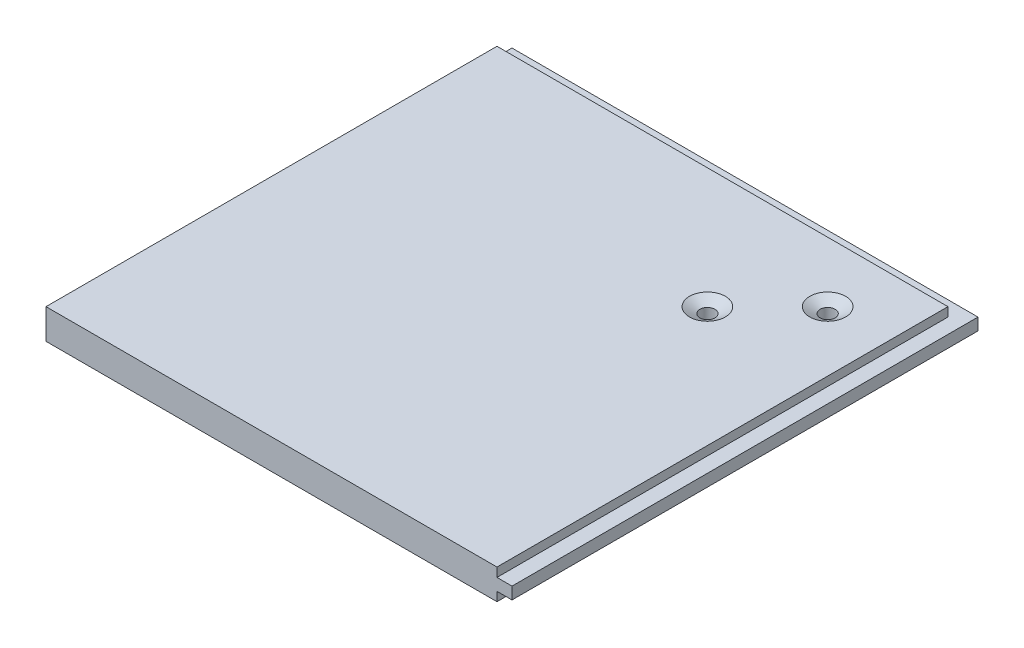
ISO-10303-21;
HEADER;
FILE_DESCRIPTION(('STEP AP214'),'2;1');
FILE_NAME('part.step','',(''),(''),'','','');
FILE_SCHEMA(('AUTOMOTIVE_DESIGN { 1 0 10303 214 1 1 1 1 }'));
ENDSEC;
DATA;
#1=APPLICATION_CONTEXT('core data for automotive mechanical design processes');
#2=APPLICATION_PROTOCOL_DEFINITION('international standard','automotive_design',2000,#1);
#3=PRODUCT_CONTEXT('',#1,'mechanical');
#4=PRODUCT('Part','Part','',(#3));
#5=PRODUCT_RELATED_PRODUCT_CATEGORY('part','',(#4));
#6=PRODUCT_DEFINITION_FORMATION('','',#4);
#7=PRODUCT_DEFINITION_CONTEXT('part definition',#1,'design');
#8=PRODUCT_DEFINITION('design','',#6,#7);
#9=PRODUCT_DEFINITION_SHAPE('','',#8);
#10=(LENGTH_UNIT() NAMED_UNIT(*) SI_UNIT(.MILLI.,.METRE.));
#11=(NAMED_UNIT(*) PLANE_ANGLE_UNIT() SI_UNIT($,.RADIAN.));
#12=(NAMED_UNIT(*) SI_UNIT($,.STERADIAN.) SOLID_ANGLE_UNIT());
#13=UNCERTAINTY_MEASURE_WITH_UNIT(LENGTH_MEASURE(1.E-05),#10,'distance_accuracy_value','');
#14=(GEOMETRIC_REPRESENTATION_CONTEXT(3) GLOBAL_UNCERTAINTY_ASSIGNED_CONTEXT((#13)) GLOBAL_UNIT_ASSIGNED_CONTEXT((#10,
#11,#12)) REPRESENTATION_CONTEXT('',''));
#15=CARTESIAN_POINT('',(0.,0.,0.));
#16=DIRECTION('',(0.,0.,1.));
#17=DIRECTION('',(1.,0.,0.));
#18=AXIS2_PLACEMENT_3D('',#15,#16,#17);
#19=CARTESIAN_POINT('',(0.,10.,-150.));
#20=DIRECTION('',(0.,0.,1.));
#21=DIRECTION('',(1.,0.,0.));
#22=AXIS2_PLACEMENT_3D('',#19,#20,#21);
#23=PLANE('',#22);
#24=DIRECTION('',(-1.,0.,0.));
#25=VECTOR('',#24,1.);
#26=CARTESIAN_POINT('',(155.,2.99999999999999,-150.));
#27=LINE('',#26,#25);
#28=CARTESIAN_POINT('',(150.,2.99999999999999,-150.));
#29=VERTEX_POINT('',#28);
#30=CARTESIAN_POINT('',(0.,3.,-150.));
#31=VERTEX_POINT('',#30);
#32=EDGE_CURVE('E201',#29,#31,#27,.T.);
#33=ORIENTED_EDGE('',*,*,#32,.F.);
#34=DIRECTION('',(0.,-1.,0.));
#35=VECTOR('',#34,1.);
#36=CARTESIAN_POINT('',(150.,10.,-150.));
#37=LINE('',#36,#35);
#38=CARTESIAN_POINT('',(150.,0.,-150.));
#39=VERTEX_POINT('',#38);
#40=EDGE_CURVE('E195',#29,#39,#37,.T.);
#41=ORIENTED_EDGE('',*,*,#40,.T.);
#42=DIRECTION('',(-1.,0.,0.));
#43=VECTOR('',#42,1.);
#44=CARTESIAN_POINT('',(0.,0.,-150.));
#45=LINE('',#44,#43);
#46=CARTESIAN_POINT('',(0.,0.,-150.));
#47=VERTEX_POINT('',#46);
#48=EDGE_CURVE('E187',#39,#47,#45,.T.);
#49=ORIENTED_EDGE('',*,*,#48,.T.);
#50=DIRECTION('',(0.,-1.,0.));
#51=VECTOR('',#50,1.);
#52=CARTESIAN_POINT('',(0.,10.,-150.));
#53=LINE('',#52,#51);
#54=EDGE_CURVE('E193',#31,#47,#53,.T.);
#55=ORIENTED_EDGE('',*,*,#54,.F.);
#56=EDGE_LOOP('',(#33,#41,#49,#55));
#57=FACE_BOUND('',#56,.T.);
#58=ADVANCED_FACE('F43',(#57),#23,.F.);
#59=DIRECTION('',(1.,0.,0.));
#60=VECTOR('',#59,1.);
#61=CARTESIAN_POINT('',(0.,7.,-150.));
#62=LINE('',#61,#60);
#63=CARTESIAN_POINT('',(0.,7.,-150.));
#64=VERTEX_POINT('',#63);
#65=CARTESIAN_POINT('',(150.,6.99999999999998,-150.));
#66=VERTEX_POINT('',#65);
#67=EDGE_CURVE('E143',#64,#66,#62,.T.);
#68=ORIENTED_EDGE('',*,*,#67,.F.);
#69=CARTESIAN_POINT('',(0.,10.,-150.));
#70=VERTEX_POINT('',#69);
#71=EDGE_CURVE('E149',#70,#64,#53,.T.);
#72=ORIENTED_EDGE('',*,*,#71,.F.);
#73=DIRECTION('',(-1.,0.,0.));
#74=VECTOR('',#73,1.);
#75=CARTESIAN_POINT('',(0.,10.,-150.));
#76=LINE('',#75,#74);
#77=CARTESIAN_POINT('',(150.,10.,-150.));
#78=VERTEX_POINT('',#77);
#79=EDGE_CURVE('E177',#78,#70,#76,.T.);
#80=ORIENTED_EDGE('',*,*,#79,.F.);
#81=EDGE_CURVE('E196',#78,#66,#37,.T.);
#82=ORIENTED_EDGE('',*,*,#81,.T.);
#83=EDGE_LOOP('',(#68,#72,#80,#82));
#84=FACE_BOUND('',#83,.T.);
#85=ADVANCED_FACE('F235',(#84),#23,.F.);
#86=CARTESIAN_POINT('',(150.,10.,-150.));
#87=DIRECTION('',(-1.,0.,0.));
#88=DIRECTION('',(0.,0.,1.));
#89=AXIS2_PLACEMENT_3D('',#86,#87,#88);
#90=PLANE('',#89);
#91=DIRECTION('',(0.,0.,1.));
#92=VECTOR('',#91,1.);
#93=CARTESIAN_POINT('',(150.,6.99999999999998,0.));
#94=LINE('',#93,#92);
#95=CARTESIAN_POINT('',(150.,6.99999999999998,0.));
#96=VERTEX_POINT('',#95);
#97=EDGE_CURVE('E152',#66,#96,#94,.T.);
#98=ORIENTED_EDGE('',*,*,#97,.F.);
#99=ORIENTED_EDGE('',*,*,#81,.F.);
#100=DIRECTION('',(0.,0.,-1.));
#101=VECTOR('',#100,1.);
#102=CARTESIAN_POINT('',(150.,10.,-150.));
#103=LINE('',#102,#101);
#104=CARTESIAN_POINT('',(150.,10.,0.));
#105=VERTEX_POINT('',#104);
#106=EDGE_CURVE('E174',#105,#78,#103,.T.);
#107=ORIENTED_EDGE('',*,*,#106,.F.);
#108=DIRECTION('',(0.,-1.,0.));
#109=VECTOR('',#108,1.);
#110=CARTESIAN_POINT('',(150.,10.,0.));
#111=LINE('',#110,#109);
#112=EDGE_CURVE('E67',#105,#96,#111,.T.);
#113=ORIENTED_EDGE('',*,*,#112,.T.);
#114=EDGE_LOOP('',(#98,#99,#107,#113));
#115=FACE_BOUND('',#114,.T.);
#116=ADVANCED_FACE('F232',(#115),#90,.F.);
#117=DIRECTION('',(0.,0.,-1.));
#118=VECTOR('',#117,1.);
#119=CARTESIAN_POINT('',(150.,2.99999999999999,-150.));
#120=LINE('',#119,#118);
#121=CARTESIAN_POINT('',(150.,2.99999999999999,0.));
#122=VERTEX_POINT('',#121);
#123=EDGE_CURVE('E59',#122,#29,#120,.T.);
#124=ORIENTED_EDGE('',*,*,#123,.F.);
#125=CARTESIAN_POINT('',(150.,0.,0.));
#126=VERTEX_POINT('',#125);
#127=EDGE_CURVE('E199',#122,#126,#111,.T.);
#128=ORIENTED_EDGE('',*,*,#127,.T.);
#129=DIRECTION('',(0.,0.,-1.));
#130=VECTOR('',#129,1.);
#131=CARTESIAN_POINT('',(150.,0.,-150.));
#132=LINE('',#131,#130);
#133=EDGE_CURVE('E184',#126,#39,#132,.T.);
#134=ORIENTED_EDGE('',*,*,#133,.T.);
#135=ORIENTED_EDGE('',*,*,#40,.F.);
#136=EDGE_LOOP('',(#124,#128,#134,#135));
#137=FACE_BOUND('',#136,.T.);
#138=ADVANCED_FACE('F241',(#137),#90,.F.);
#139=CARTESIAN_POINT('',(0.,10.,0.));
#140=DIRECTION('',(0.,0.,-1.));
#141=DIRECTION('',(-1.,0.,0.));
#142=AXIS2_PLACEMENT_3D('',#139,#140,#141);
#143=PLANE('',#142);
#144=DIRECTION('',(1.,0.,0.));
#145=VECTOR('',#144,1.);
#146=CARTESIAN_POINT('',(0.,0.,0.));
#147=LINE('',#146,#145);
#148=CARTESIAN_POINT('',(0.,0.,0.));
#149=VERTEX_POINT('',#148);
#150=EDGE_CURVE('E170',#149,#126,#147,.T.);
#151=ORIENTED_EDGE('',*,*,#150,.T.);
#152=ORIENTED_EDGE('',*,*,#127,.F.);
#153=DIRECTION('',(-1.,0.,0.));
#154=VECTOR('',#153,1.);
#155=CARTESIAN_POINT('',(155.,2.99999999999998,0.));
#156=LINE('',#155,#154);
#157=CARTESIAN_POINT('',(155.,2.99999999999998,0.));
#158=VERTEX_POINT('',#157);
#159=EDGE_CURVE('E167',#158,#122,#156,.T.);
#160=ORIENTED_EDGE('',*,*,#159,.F.);
#161=DIRECTION('',(0.,-1.,0.));
#162=VECTOR('',#161,1.);
#163=CARTESIAN_POINT('',(155.,2.99999999999998,0.));
#164=LINE('',#163,#162);
#165=CARTESIAN_POINT('',(155.,6.99999999999998,0.));
#166=VERTEX_POINT('',#165);
#167=EDGE_CURVE('E157',#166,#158,#164,.T.);
#168=ORIENTED_EDGE('',*,*,#167,.F.);
#169=DIRECTION('',(-1.,0.,0.));
#170=VECTOR('',#169,1.);
#171=CARTESIAN_POINT('',(155.,6.99999999999998,0.));
#172=LINE('',#171,#170);
#173=EDGE_CURVE('E162',#166,#96,#172,.T.);
#174=ORIENTED_EDGE('',*,*,#173,.T.);
#175=ORIENTED_EDGE('',*,*,#112,.F.);
#176=DIRECTION('',(1.,0.,0.));
#177=VECTOR('',#176,1.);
#178=CARTESIAN_POINT('',(0.,10.,0.));
#179=LINE('',#178,#177);
#180=CARTESIAN_POINT('',(0.,10.,0.));
#181=VERTEX_POINT('',#180);
#182=EDGE_CURVE('E171',#181,#105,#179,.T.);
#183=ORIENTED_EDGE('',*,*,#182,.F.);
#184=DIRECTION('',(0.,-1.,0.));
#185=VECTOR('',#184,1.);
#186=CARTESIAN_POINT('',(0.,10.,0.));
#187=LINE('',#186,#185);
#188=EDGE_CURVE('E181',#181,#149,#187,.T.);
#189=ORIENTED_EDGE('',*,*,#188,.T.);
#190=EDGE_LOOP('',(#151,#152,#160,#168,#174,#175,#183,#189));
#191=FACE_BOUND('',#190,.T.);
#192=ADVANCED_FACE('F229',(#191),#143,.F.);
#193=CARTESIAN_POINT('',(0.,10.,0.));
#194=DIRECTION('',(1.,0.,0.));
#195=DIRECTION('',(0.,0.,-1.));
#196=AXIS2_PLACEMENT_3D('',#193,#194,#195);
#197=PLANE('',#196);
#198=DIRECTION('',(0.,0.,1.));
#199=VECTOR('',#198,1.);
#200=CARTESIAN_POINT('',(0.,0.,0.));
#201=LINE('',#200,#199);
#202=EDGE_CURVE('E175',#47,#149,#201,.T.);
#203=ORIENTED_EDGE('',*,*,#202,.T.);
#204=ORIENTED_EDGE('',*,*,#188,.F.);
#205=DIRECTION('',(0.,0.,1.));
#206=VECTOR('',#205,1.);
#207=CARTESIAN_POINT('',(0.,10.,0.));
#208=LINE('',#207,#206);
#209=EDGE_CURVE('E179',#70,#181,#208,.T.);
#210=ORIENTED_EDGE('',*,*,#209,.F.);
#211=ORIENTED_EDGE('',*,*,#71,.T.);
#212=DIRECTION('',(0.,0.,1.));
#213=VECTOR('',#212,1.);
#214=CARTESIAN_POINT('',(0.,7.,-155.));
#215=LINE('',#214,#213);
#216=CARTESIAN_POINT('',(0.,7.,-155.));
#217=VERTEX_POINT('',#216);
#218=EDGE_CURVE('E126',#217,#64,#215,.T.);
#219=ORIENTED_EDGE('',*,*,#218,.F.);
#220=DIRECTION('',(0.,1.,0.));
#221=VECTOR('',#220,1.);
#222=CARTESIAN_POINT('',(0.,7.,-155.));
#223=LINE('',#222,#221);
#224=CARTESIAN_POINT('',(0.,3.,-155.));
#225=VERTEX_POINT('',#224);
#226=EDGE_CURVE('E134',#225,#217,#223,.T.);
#227=ORIENTED_EDGE('',*,*,#226,.F.);
#228=DIRECTION('',(0.,0.,1.));
#229=VECTOR('',#228,1.);
#230=CARTESIAN_POINT('',(0.,3.,-155.));
#231=LINE('',#230,#229);
#232=EDGE_CURVE('E150',#225,#31,#231,.T.);
#233=ORIENTED_EDGE('',*,*,#232,.T.);
#234=ORIENTED_EDGE('',*,*,#54,.T.);
#235=EDGE_LOOP('',(#203,#204,#210,#211,#219,#227,#233,#234));
#236=FACE_BOUND('',#235,.T.);
#237=ADVANCED_FACE('F146',(#236),#197,.F.);
#238=CARTESIAN_POINT('',(0.,10.,0.));
#239=DIRECTION('',(0.,-1.,0.));
#240=DIRECTION('',(0.,0.,-1.));
#241=AXIS2_PLACEMENT_3D('',#238,#239,#240);
#242=PLANE('',#241);
#243=CARTESIAN_POINT('',(130.,10.,-130.));
#244=DIRECTION('',(0.,-1.,0.));
#245=DIRECTION('',(0.,0.,-1.));
#246=AXIS2_PLACEMENT_3D('',#243,#244,#245);
#247=CIRCLE('',#246,5.96410161513772);
#248=CARTESIAN_POINT('',(130.,10.,-135.964101615138));
#249=VERTEX_POINT('',#248);
#250=EDGE_CURVE('E205',#249,#249,#247,.T.);
#251=ORIENTED_EDGE('',*,*,#250,.T.);
#252=EDGE_LOOP('',(#251));
#253=FACE_BOUND('',#252,.T.);
#254=CARTESIAN_POINT('',(110.,10.,-110.));
#255=DIRECTION('',(0.,-1.,0.));
#256=DIRECTION('',(0.,0.,-1.));
#257=AXIS2_PLACEMENT_3D('',#254,#255,#256);
#258=CIRCLE('',#257,5.96410161513777);
#259=CARTESIAN_POINT('',(110.,10.,-115.964101615138));
#260=VERTEX_POINT('',#259);
#261=EDGE_CURVE('E202',#260,#260,#258,.T.);
#262=ORIENTED_EDGE('',*,*,#261,.T.);
#263=EDGE_LOOP('',(#262));
#264=FACE_BOUND('',#263,.T.);
#265=ORIENTED_EDGE('',*,*,#182,.T.);
#266=ORIENTED_EDGE('',*,*,#106,.T.);
#267=ORIENTED_EDGE('',*,*,#79,.T.);
#268=ORIENTED_EDGE('',*,*,#209,.T.);
#269=EDGE_LOOP('',(#265,#266,#267,#268));
#270=FACE_BOUND('',#269,.T.);
#271=ADVANCED_FACE('F218',(#253,#264,#270),#242,.F.);
#272=CARTESIAN_POINT('',(0.,0.,0.));
#273=DIRECTION('',(0.,-1.,0.));
#274=DIRECTION('',(0.,0.,-1.));
#275=AXIS2_PLACEMENT_3D('',#272,#273,#274);
#276=PLANE('',#275);
#277=CARTESIAN_POINT('',(130.,0.,-130.));
#278=DIRECTION('',(0.,1.,0.));
#279=DIRECTION('',(0.,0.,1.));
#280=AXIS2_PLACEMENT_3D('',#277,#278,#279);
#281=CIRCLE('',#280,2.5);
#282=CARTESIAN_POINT('',(130.,0.,-127.5));
#283=VERTEX_POINT('',#282);
#284=EDGE_CURVE('E249',#283,#283,#281,.T.);
#285=ORIENTED_EDGE('',*,*,#284,.T.);
#286=EDGE_LOOP('',(#285));
#287=FACE_BOUND('',#286,.T.);
#288=CARTESIAN_POINT('',(110.,0.,-110.));
#289=DIRECTION('',(0.,1.,0.));
#290=DIRECTION('',(0.,0.,1.));
#291=AXIS2_PLACEMENT_3D('',#288,#289,#290);
#292=CIRCLE('',#291,2.5);
#293=CARTESIAN_POINT('',(110.,0.,-107.5));
#294=VERTEX_POINT('',#293);
#295=EDGE_CURVE('E408',#294,#294,#292,.T.);
#296=ORIENTED_EDGE('',*,*,#295,.T.);
#297=EDGE_LOOP('',(#296));
#298=FACE_BOUND('',#297,.T.);
#299=ORIENTED_EDGE('',*,*,#150,.F.);
#300=ORIENTED_EDGE('',*,*,#202,.F.);
#301=ORIENTED_EDGE('',*,*,#48,.F.);
#302=ORIENTED_EDGE('',*,*,#133,.F.);
#303=EDGE_LOOP('',(#299,#300,#301,#302));
#304=FACE_BOUND('',#303,.T.);
#305=ADVANCED_FACE('F221',(#287,#298,#304),#276,.T.);
#306=CARTESIAN_POINT('',(155.,2.99999999999999,-150.));
#307=DIRECTION('',(0.,1.,0.));
#308=DIRECTION('',(0.,0.,1.));
#309=AXIS2_PLACEMENT_3D('',#306,#307,#308);
#310=PLANE('',#309);
#311=ORIENTED_EDGE('',*,*,#123,.T.);
#312=ORIENTED_EDGE('',*,*,#32,.T.);
#313=ORIENTED_EDGE('',*,*,#232,.F.);
#314=DIRECTION('',(-1.,0.,0.));
#315=VECTOR('',#314,1.);
#316=CARTESIAN_POINT('',(155.,2.99999999999999,-155.));
#317=LINE('',#316,#315);
#318=CARTESIAN_POINT('',(155.,2.99999999999999,-155.));
#319=VERTEX_POINT('',#318);
#320=EDGE_CURVE('E139',#319,#225,#317,.T.);
#321=ORIENTED_EDGE('',*,*,#320,.F.);
#322=DIRECTION('',(0.,0.,-1.));
#323=VECTOR('',#322,1.);
#324=CARTESIAN_POINT('',(155.,2.99999999999999,-150.));
#325=LINE('',#324,#323);
#326=EDGE_CURVE('E160',#158,#319,#325,.T.);
#327=ORIENTED_EDGE('',*,*,#326,.F.);
#328=ORIENTED_EDGE('',*,*,#159,.T.);
#329=EDGE_LOOP('',(#311,#312,#313,#321,#327,#328));
#330=FACE_BOUND('',#329,.T.);
#331=ADVANCED_FACE('F243',(#330),#310,.F.);
#332=CARTESIAN_POINT('',(155.,6.99999999999998,0.));
#333=DIRECTION('',(0.,-1.,0.));
#334=DIRECTION('',(0.,0.,-1.));
#335=AXIS2_PLACEMENT_3D('',#332,#333,#334);
#336=PLANE('',#335);
#337=ORIENTED_EDGE('',*,*,#97,.T.);
#338=ORIENTED_EDGE('',*,*,#173,.F.);
#339=DIRECTION('',(0.,0.,1.));
#340=VECTOR('',#339,1.);
#341=CARTESIAN_POINT('',(155.,6.99999999999998,0.));
#342=LINE('',#341,#340);
#343=CARTESIAN_POINT('',(155.,6.99999999999998,-155.));
#344=VERTEX_POINT('',#343);
#345=EDGE_CURVE('E129',#344,#166,#342,.T.);
#346=ORIENTED_EDGE('',*,*,#345,.F.);
#347=DIRECTION('',(1.,0.,0.));
#348=VECTOR('',#347,1.);
#349=CARTESIAN_POINT('',(0.,7.,-155.));
#350=LINE('',#349,#348);
#351=EDGE_CURVE('E122',#217,#344,#350,.T.);
#352=ORIENTED_EDGE('',*,*,#351,.F.);
#353=ORIENTED_EDGE('',*,*,#218,.T.);
#354=ORIENTED_EDGE('',*,*,#67,.T.);
#355=EDGE_LOOP('',(#337,#338,#346,#352,#353,#354));
#356=FACE_BOUND('',#355,.T.);
#357=ADVANCED_FACE('F124',(#356),#336,.F.);
#358=CARTESIAN_POINT('',(155.,0.,0.));
#359=DIRECTION('',(-1.,0.,0.));
#360=DIRECTION('',(0.,0.,1.));
#361=AXIS2_PLACEMENT_3D('',#358,#359,#360);
#362=PLANE('',#361);
#363=ORIENTED_EDGE('',*,*,#167,.T.);
#364=ORIENTED_EDGE('',*,*,#326,.T.);
#365=DIRECTION('',(0.,-1.,0.));
#366=VECTOR('',#365,1.);
#367=CARTESIAN_POINT('',(155.,6.99999999999998,-155.));
#368=LINE('',#367,#366);
#369=EDGE_CURVE('E133',#344,#319,#368,.T.);
#370=ORIENTED_EDGE('',*,*,#369,.F.);
#371=ORIENTED_EDGE('',*,*,#345,.T.);
#372=EDGE_LOOP('',(#363,#364,#370,#371));
#373=FACE_BOUND('',#372,.T.);
#374=ADVANCED_FACE('F245',(#373),#362,.F.);
#375=CARTESIAN_POINT('',(0.,0.,-155.));
#376=DIRECTION('',(0.,0.,-1.));
#377=DIRECTION('',(-1.,0.,0.));
#378=AXIS2_PLACEMENT_3D('',#375,#376,#377);
#379=PLANE('',#378);
#380=ORIENTED_EDGE('',*,*,#226,.T.);
#381=ORIENTED_EDGE('',*,*,#351,.T.);
#382=ORIENTED_EDGE('',*,*,#369,.T.);
#383=ORIENTED_EDGE('',*,*,#320,.T.);
#384=EDGE_LOOP('',(#380,#381,#382,#383));
#385=FACE_BOUND('',#384,.T.);
#386=ADVANCED_FACE('F137',(#385),#379,.T.);
#387=CARTESIAN_POINT('',(110.,0.,-110.));
#388=DIRECTION('',(0.,1.,0.));
#389=DIRECTION('',(0.,0.,1.));
#390=AXIS2_PLACEMENT_3D('',#387,#388,#389);
#391=CYLINDRICAL_SURFACE('',#390,2.5);
#392=CARTESIAN_POINT('',(110.,7.99999999999997,-110.));
#393=DIRECTION('',(0.,-1.,0.));
#394=DIRECTION('',(0.,0.,-1.));
#395=AXIS2_PLACEMENT_3D('',#392,#393,#394);
#396=CIRCLE('',#395,2.5);
#397=CARTESIAN_POINT('',(110.,7.99999999999997,-112.5));
#398=VERTEX_POINT('',#397);
#399=EDGE_CURVE('E11',#398,#398,#396,.F.);
#400=ORIENTED_EDGE('',*,*,#399,.T.);
#401=EDGE_LOOP('',(#400));
#402=FACE_BOUND('',#401,.T.);
#403=ORIENTED_EDGE('',*,*,#295,.F.);
#404=EDGE_LOOP('',(#403));
#405=FACE_BOUND('',#404,.T.);
#406=ADVANCED_FACE('F310',(#402,#405),#391,.F.);
#407=CARTESIAN_POINT('',(130.,0.,-130.));
#408=DIRECTION('',(0.,1.,0.));
#409=DIRECTION('',(0.,0.,1.));
#410=AXIS2_PLACEMENT_3D('',#407,#408,#409);
#411=CYLINDRICAL_SURFACE('',#410,2.5);
#412=CARTESIAN_POINT('',(130.,8.00000000000003,-130.));
#413=DIRECTION('',(0.,-1.,0.));
#414=DIRECTION('',(0.,0.,-1.));
#415=AXIS2_PLACEMENT_3D('',#412,#413,#414);
#416=CIRCLE('',#415,2.5);
#417=CARTESIAN_POINT('',(130.,8.00000000000003,-132.5));
#418=VERTEX_POINT('',#417);
#419=EDGE_CURVE('E52',#418,#418,#416,.F.);
#420=ORIENTED_EDGE('',*,*,#419,.T.);
#421=EDGE_LOOP('',(#420));
#422=FACE_BOUND('',#421,.T.);
#423=ORIENTED_EDGE('',*,*,#284,.F.);
#424=EDGE_LOOP('',(#423));
#425=FACE_BOUND('',#424,.T.);
#426=ADVANCED_FACE('F210',(#422,#425),#411,.F.);
#427=CARTESIAN_POINT('',(130.,10.,-130.));
#428=DIRECTION('',(0.,1.,0.));
#429=DIRECTION('',(0.,0.,1.));
#430=AXIS2_PLACEMENT_3D('',#427,#428,#429);
#431=CONICAL_SURFACE('',#430,5.96410161513772,1.0471975511966);
#432=ORIENTED_EDGE('',*,*,#419,.F.);
#433=EDGE_LOOP('',(#432));
#434=FACE_BOUND('',#433,.T.);
#435=ORIENTED_EDGE('',*,*,#250,.F.);
#436=EDGE_LOOP('',(#435));
#437=FACE_BOUND('',#436,.T.);
#438=ADVANCED_FACE('F213',(#434,#437),#431,.F.);
#439=CARTESIAN_POINT('',(110.,10.,-110.));
#440=DIRECTION('',(0.,1.,0.));
#441=DIRECTION('',(0.,0.,1.));
#442=AXIS2_PLACEMENT_3D('',#439,#440,#441);
#443=CONICAL_SURFACE('',#442,5.96410161513777,1.04719755119659);
#444=ORIENTED_EDGE('',*,*,#399,.F.);
#445=EDGE_LOOP('',(#444));
#446=FACE_BOUND('',#445,.T.);
#447=ORIENTED_EDGE('',*,*,#261,.F.);
#448=EDGE_LOOP('',(#447));
#449=FACE_BOUND('',#448,.T.);
#450=ADVANCED_FACE('F46',(#446,#449),#443,.F.);
#451=CLOSED_SHELL('',(#58,#85,#116,#138,#192,#237,#271,#305,#331,#357,#374,#386,#406,#426,#438,#450));
#452=MANIFOLD_SOLID_BREP('B2',#451);
#453=ADVANCED_BREP_SHAPE_REPRESENTATION('',(#18,#452),#14);
#454=SHAPE_DEFINITION_REPRESENTATION(#9,#453);
ENDSEC;
END-ISO-10303-21;
